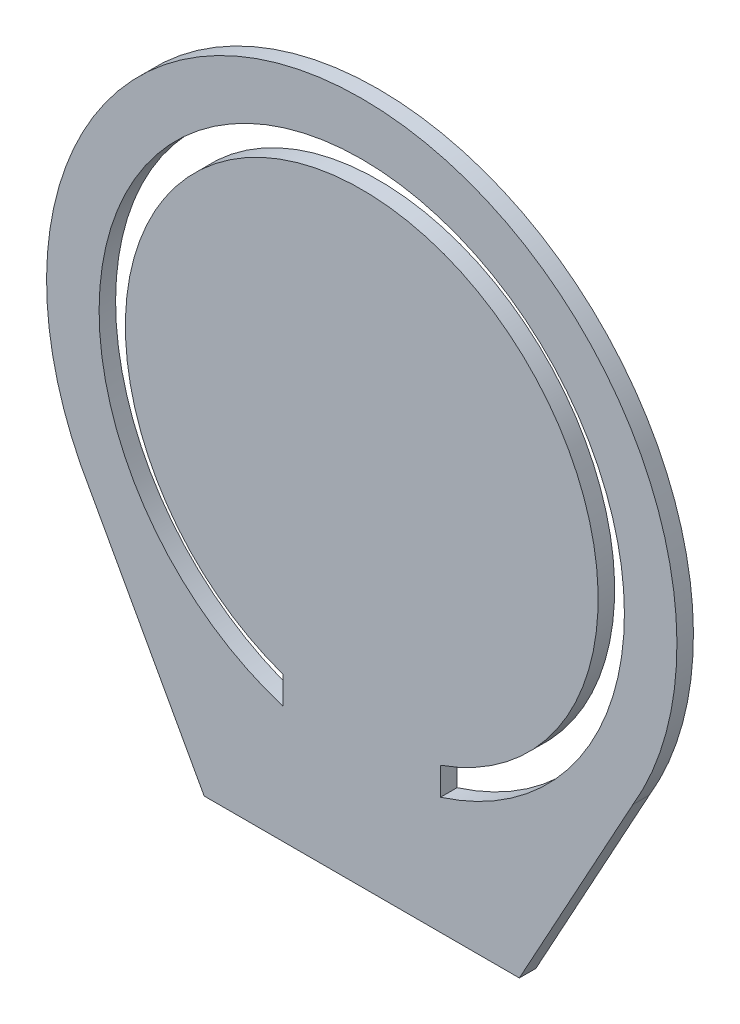
ISO-10303-21;
HEADER;
FILE_DESCRIPTION(('STEP AP214'),'2;1');
FILE_NAME('part.step','',(''),(''),'','','');
FILE_SCHEMA(('AUTOMOTIVE_DESIGN { 1 0 10303 214 1 1 1 1 }'));
ENDSEC;
DATA;
#1=APPLICATION_CONTEXT('core data for automotive mechanical design processes');
#2=APPLICATION_PROTOCOL_DEFINITION('international standard','automotive_design',2000,#1);
#3=PRODUCT_CONTEXT('',#1,'mechanical');
#4=PRODUCT('Part','Part','',(#3));
#5=PRODUCT_RELATED_PRODUCT_CATEGORY('part','',(#4));
#6=PRODUCT_DEFINITION_FORMATION('','',#4);
#7=PRODUCT_DEFINITION_CONTEXT('part definition',#1,'design');
#8=PRODUCT_DEFINITION('design','',#6,#7);
#9=PRODUCT_DEFINITION_SHAPE('','',#8);
#10=(LENGTH_UNIT() NAMED_UNIT(*) SI_UNIT(.MILLI.,.METRE.));
#11=(NAMED_UNIT(*) PLANE_ANGLE_UNIT() SI_UNIT($,.RADIAN.));
#12=(NAMED_UNIT(*) SI_UNIT($,.STERADIAN.) SOLID_ANGLE_UNIT());
#13=UNCERTAINTY_MEASURE_WITH_UNIT(LENGTH_MEASURE(1.E-05),#10,'distance_accuracy_value','');
#14=(GEOMETRIC_REPRESENTATION_CONTEXT(3) GLOBAL_UNCERTAINTY_ASSIGNED_CONTEXT((#13)) GLOBAL_UNIT_ASSIGNED_CONTEXT((#10,
#11,#12)) REPRESENTATION_CONTEXT('',''));
#15=CARTESIAN_POINT('',(0.,0.,0.));
#16=DIRECTION('',(0.,0.,1.));
#17=DIRECTION('',(1.,0.,0.));
#18=AXIS2_PLACEMENT_3D('',#15,#16,#17);
#19=CARTESIAN_POINT('',(0.,0.,1.57));
#20=DIRECTION('',(0.,0.,-1.));
#21=DIRECTION('',(-1.,0.,0.));
#22=AXIS2_PLACEMENT_3D('',#19,#20,#21);
#23=CYLINDRICAL_SURFACE('',#22,25.);
#24=DIRECTION('',(0.,0.,-1.));
#25=VECTOR('',#24,1.);
#26=CARTESIAN_POINT('',(-7.5,-23.8484800354236,1.57));
#27=LINE('',#26,#25);
#28=CARTESIAN_POINT('',(-7.5,-23.8484800354236,0.));
#29=VERTEX_POINT('',#28);
#30=CARTESIAN_POINT('',(-7.5,-23.8484800354236,1.57));
#31=VERTEX_POINT('',#30);
#32=EDGE_CURVE('E11',#29,#31,#27,.F.);
#33=ORIENTED_EDGE('',*,*,#32,.F.);
#34=CARTESIAN_POINT('',(0.,0.,0.));
#35=DIRECTION('',(0.,0.,1.));
#36=DIRECTION('',(1.,0.,0.));
#37=AXIS2_PLACEMENT_3D('',#34,#35,#36);
#38=CIRCLE('',#37,25.);
#39=CARTESIAN_POINT('',(7.5,-23.8484800354236,0.));
#40=VERTEX_POINT('',#39);
#41=EDGE_CURVE('E150',#40,#29,#38,.T.);
#42=ORIENTED_EDGE('',*,*,#41,.F.);
#43=DIRECTION('',(0.,0.,-1.));
#44=VECTOR('',#43,1.);
#45=CARTESIAN_POINT('',(7.5,-23.8484800354236,1.57));
#46=LINE('',#45,#44);
#47=CARTESIAN_POINT('',(7.5,-23.8484800354236,1.57));
#48=VERTEX_POINT('',#47);
#49=EDGE_CURVE('E48',#40,#48,#46,.F.);
#50=ORIENTED_EDGE('',*,*,#49,.T.);
#51=CARTESIAN_POINT('',(0.,0.,1.57));
#52=DIRECTION('',(0.,0.,1.));
#53=DIRECTION('',(1.,0.,0.));
#54=AXIS2_PLACEMENT_3D('',#51,#52,#53);
#55=CIRCLE('',#54,25.);
#56=EDGE_CURVE('E156',#48,#31,#55,.T.);
#57=ORIENTED_EDGE('',*,*,#56,.T.);
#58=EDGE_LOOP('',(#33,#42,#50,#57));
#59=FACE_BOUND('',#58,.T.);
#60=ADVANCED_FACE('F40',(#59),#23,.F.);
#61=CARTESIAN_POINT('',(0.,0.,1.57));
#62=DIRECTION('',(0.,0.,-1.));
#63=DIRECTION('',(-1.,0.,0.));
#64=AXIS2_PLACEMENT_3D('',#61,#62,#63);
#65=CYLINDRICAL_SURFACE('',#64,30.);
#66=DIRECTION('',(0.,0.,1.));
#67=VECTOR('',#66,1.);
#68=CARTESIAN_POINT('',(-25.8005366625302,-15.3079165115778,0.));
#69=LINE('',#68,#67);
#70=CARTESIAN_POINT('',(-25.8005366625302,-15.3079165115778,0.));
#71=VERTEX_POINT('',#70);
#72=CARTESIAN_POINT('',(-25.8005366625302,-15.3079165115778,1.57));
#73=VERTEX_POINT('',#72);
#74=EDGE_CURVE('E147',#71,#73,#69,.T.);
#75=ORIENTED_EDGE('',*,*,#74,.T.);
#76=CARTESIAN_POINT('',(0.,0.,1.57));
#77=DIRECTION('',(0.,0.,1.));
#78=DIRECTION('',(1.,0.,0.));
#79=AXIS2_PLACEMENT_3D('',#76,#77,#78);
#80=CIRCLE('',#79,30.);
#81=CARTESIAN_POINT('',(25.8005366625301,-15.3079165115779,1.57));
#82=VERTEX_POINT('',#81);
#83=EDGE_CURVE('E161',#82,#73,#80,.T.);
#84=ORIENTED_EDGE('',*,*,#83,.F.);
#85=DIRECTION('',(0.,0.,1.));
#86=VECTOR('',#85,1.);
#87=CARTESIAN_POINT('',(25.8005366625301,-15.3079165115779,0.));
#88=LINE('',#87,#86);
#89=CARTESIAN_POINT('',(25.8005366625301,-15.3079165115779,0.));
#90=VERTEX_POINT('',#89);
#91=EDGE_CURVE('E151',#90,#82,#88,.T.);
#92=ORIENTED_EDGE('',*,*,#91,.F.);
#93=CARTESIAN_POINT('',(0.,0.,0.));
#94=DIRECTION('',(0.,0.,1.));
#95=DIRECTION('',(1.,0.,0.));
#96=AXIS2_PLACEMENT_3D('',#93,#94,#95);
#97=CIRCLE('',#96,30.);
#98=EDGE_CURVE('E159',#90,#71,#97,.T.);
#99=ORIENTED_EDGE('',*,*,#98,.T.);
#100=EDGE_LOOP('',(#75,#84,#92,#99));
#101=FACE_BOUND('',#100,.T.);
#102=ADVANCED_FACE('F42',(#101),#65,.T.);
#103=CARTESIAN_POINT('',(0.,0.,1.57));
#104=DIRECTION('',(0.,0.,1.));
#105=DIRECTION('',(1.,0.,0.));
#106=AXIS2_PLACEMENT_3D('',#103,#104,#105);
#107=PLANE('',#106);
#108=DIRECTION('',(0.,1.,0.));
#109=VECTOR('',#108,1.);
#110=CARTESIAN_POINT('',(-7.5,0.,1.57));
#111=LINE('',#110,#109);
#112=CARTESIAN_POINT('',(-7.5,-21.2132034355964,1.57));
#113=VERTEX_POINT('',#112);
#114=EDGE_CURVE('E112',#31,#113,#111,.T.);
#115=ORIENTED_EDGE('',*,*,#114,.F.);
#116=ORIENTED_EDGE('',*,*,#56,.F.);
#117=DIRECTION('',(0.,1.,0.));
#118=VECTOR('',#117,1.);
#119=CARTESIAN_POINT('',(7.5,0.,1.57));
#120=LINE('',#119,#118);
#121=CARTESIAN_POINT('',(7.5,-21.2132034355964,1.57));
#122=VERTEX_POINT('',#121);
#123=EDGE_CURVE('E123',#48,#122,#120,.T.);
#124=ORIENTED_EDGE('',*,*,#123,.T.);
#125=CARTESIAN_POINT('',(0.,0.,1.57));
#126=DIRECTION('',(0.,0.,1.));
#127=DIRECTION('',(1.,0.,0.));
#128=AXIS2_PLACEMENT_3D('',#125,#126,#127);
#129=CIRCLE('',#128,22.5);
#130=EDGE_CURVE('E121',#122,#113,#129,.T.);
#131=ORIENTED_EDGE('',*,*,#130,.T.);
#132=EDGE_LOOP('',(#115,#116,#124,#131));
#133=FACE_BOUND('',#132,.T.);
#134=ORIENTED_EDGE('',*,*,#83,.T.);
#135=DIRECTION('',(-0.480889164745887,0.876781393067852,0.));
#136=VECTOR('',#135,1.);
#137=CARTESIAN_POINT('',(-26.2883976806498,-14.4184236836069,1.57));
#138=LINE('',#137,#136);
#139=CARTESIAN_POINT('',(-15.,-35.,1.57));
#140=VERTEX_POINT('',#139);
#141=EDGE_CURVE('E134',#140,#73,#138,.T.);
#142=ORIENTED_EDGE('',*,*,#141,.F.);
#143=DIRECTION('',(1.,0.,0.));
#144=VECTOR('',#143,1.);
#145=CARTESIAN_POINT('',(0.,-35.,1.57));
#146=LINE('',#145,#144);
#147=CARTESIAN_POINT('',(15.,-35.,1.57));
#148=VERTEX_POINT('',#147);
#149=EDGE_CURVE('E144',#140,#148,#146,.T.);
#150=ORIENTED_EDGE('',*,*,#149,.T.);
#151=DIRECTION('',(0.480889164745886,0.876781393067852,0.));
#152=VECTOR('',#151,1.);
#153=CARTESIAN_POINT('',(26.2883976806498,-14.4184236836069,1.57));
#154=LINE('',#153,#152);
#155=EDGE_CURVE('E63',#148,#82,#154,.T.);
#156=ORIENTED_EDGE('',*,*,#155,.T.);
#157=EDGE_LOOP('',(#134,#142,#150,#156));
#158=FACE_BOUND('',#157,.T.);
#159=ADVANCED_FACE('F169',(#133,#158),#107,.T.);
#160=CARTESIAN_POINT('',(0.,0.,0.));
#161=DIRECTION('',(0.,0.,1.));
#162=DIRECTION('',(1.,0.,0.));
#163=AXIS2_PLACEMENT_3D('',#160,#161,#162);
#164=PLANE('',#163);
#165=ORIENTED_EDGE('',*,*,#98,.F.);
#166=DIRECTION('',(0.480889164745886,0.876781393067852,0.));
#167=VECTOR('',#166,1.);
#168=CARTESIAN_POINT('',(26.2883976806498,-14.4184236836069,0.));
#169=LINE('',#168,#167);
#170=CARTESIAN_POINT('',(15.,-35.,0.));
#171=VERTEX_POINT('',#170);
#172=EDGE_CURVE('E140',#171,#90,#169,.T.);
#173=ORIENTED_EDGE('',*,*,#172,.F.);
#174=DIRECTION('',(1.,0.,0.));
#175=VECTOR('',#174,1.);
#176=CARTESIAN_POINT('',(0.,-35.,0.));
#177=LINE('',#176,#175);
#178=CARTESIAN_POINT('',(-15.,-35.,0.));
#179=VERTEX_POINT('',#178);
#180=EDGE_CURVE('E137',#179,#171,#177,.T.);
#181=ORIENTED_EDGE('',*,*,#180,.F.);
#182=DIRECTION('',(-0.480889164745887,0.876781393067852,0.));
#183=VECTOR('',#182,1.);
#184=CARTESIAN_POINT('',(-26.2883976806498,-14.4184236836069,0.));
#185=LINE('',#184,#183);
#186=EDGE_CURVE('E135',#179,#71,#185,.T.);
#187=ORIENTED_EDGE('',*,*,#186,.T.);
#188=EDGE_LOOP('',(#165,#173,#181,#187));
#189=FACE_BOUND('',#188,.T.);
#190=ORIENTED_EDGE('',*,*,#41,.T.);
#191=DIRECTION('',(0.,1.,0.));
#192=VECTOR('',#191,1.);
#193=CARTESIAN_POINT('',(-7.5,0.,0.));
#194=LINE('',#193,#192);
#195=CARTESIAN_POINT('',(-7.5,-21.2132034355964,0.));
#196=VERTEX_POINT('',#195);
#197=EDGE_CURVE('E113',#29,#196,#194,.T.);
#198=ORIENTED_EDGE('',*,*,#197,.T.);
#199=CARTESIAN_POINT('',(0.,0.,0.));
#200=DIRECTION('',(0.,0.,1.));
#201=DIRECTION('',(1.,0.,0.));
#202=AXIS2_PLACEMENT_3D('',#199,#200,#201);
#203=CIRCLE('',#202,22.5);
#204=CARTESIAN_POINT('',(7.5,-21.2132034355964,0.));
#205=VERTEX_POINT('',#204);
#206=EDGE_CURVE('E119',#205,#196,#203,.T.);
#207=ORIENTED_EDGE('',*,*,#206,.F.);
#208=DIRECTION('',(0.,1.,0.));
#209=VECTOR('',#208,1.);
#210=CARTESIAN_POINT('',(7.5,0.,0.));
#211=LINE('',#210,#209);
#212=EDGE_CURVE('E55',#40,#205,#211,.T.);
#213=ORIENTED_EDGE('',*,*,#212,.F.);
#214=EDGE_LOOP('',(#190,#198,#207,#213));
#215=FACE_BOUND('',#214,.T.);
#216=ADVANCED_FACE('F125',(#189,#215),#164,.F.);
#217=CARTESIAN_POINT('',(-26.2883976806498,-14.4184236836069,0.));
#218=DIRECTION('',(0.876781393067852,0.480889164745887,0.));
#219=DIRECTION('',(-0.480889164745887,0.876781393067852,0.));
#220=AXIS2_PLACEMENT_3D('',#217,#218,#219);
#221=PLANE('',#220);
#222=ORIENTED_EDGE('',*,*,#141,.T.);
#223=ORIENTED_EDGE('',*,*,#74,.F.);
#224=ORIENTED_EDGE('',*,*,#186,.F.);
#225=DIRECTION('',(0.,0.,1.));
#226=VECTOR('',#225,1.);
#227=CARTESIAN_POINT('',(-15.,-35.,0.));
#228=LINE('',#227,#226);
#229=EDGE_CURVE('E142',#179,#140,#228,.T.);
#230=ORIENTED_EDGE('',*,*,#229,.T.);
#231=EDGE_LOOP('',(#222,#223,#224,#230));
#232=FACE_BOUND('',#231,.T.);
#233=ADVANCED_FACE('F192',(#232),#221,.F.);
#234=CARTESIAN_POINT('',(26.2883976806498,-14.4184236836069,0.));
#235=DIRECTION('',(0.876781393067852,-0.480889164745886,0.));
#236=DIRECTION('',(0.480889164745886,0.876781393067852,0.));
#237=AXIS2_PLACEMENT_3D('',#234,#235,#236);
#238=PLANE('',#237);
#239=ORIENTED_EDGE('',*,*,#155,.F.);
#240=DIRECTION('',(0.,0.,1.));
#241=VECTOR('',#240,1.);
#242=CARTESIAN_POINT('',(15.,-35.,0.));
#243=LINE('',#242,#241);
#244=EDGE_CURVE('E153',#171,#148,#243,.T.);
#245=ORIENTED_EDGE('',*,*,#244,.F.);
#246=ORIENTED_EDGE('',*,*,#172,.T.);
#247=ORIENTED_EDGE('',*,*,#91,.T.);
#248=EDGE_LOOP('',(#239,#245,#246,#247));
#249=FACE_BOUND('',#248,.T.);
#250=ADVANCED_FACE('F180',(#249),#238,.T.);
#251=CARTESIAN_POINT('',(0.,-35.,0.));
#252=DIRECTION('',(0.,-1.,0.));
#253=DIRECTION('',(0.,0.,-1.));
#254=AXIS2_PLACEMENT_3D('',#251,#252,#253);
#255=PLANE('',#254);
#256=ORIENTED_EDGE('',*,*,#149,.F.);
#257=ORIENTED_EDGE('',*,*,#229,.F.);
#258=ORIENTED_EDGE('',*,*,#180,.T.);
#259=ORIENTED_EDGE('',*,*,#244,.T.);
#260=EDGE_LOOP('',(#256,#257,#258,#259));
#261=FACE_BOUND('',#260,.T.);
#262=ADVANCED_FACE('F173',(#261),#255,.T.);
#263=CARTESIAN_POINT('',(-7.5,0.,1.57));
#264=DIRECTION('',(-1.,0.,0.));
#265=DIRECTION('',(0.,0.,1.));
#266=AXIS2_PLACEMENT_3D('',#263,#264,#265);
#267=PLANE('',#266);
#268=ORIENTED_EDGE('',*,*,#197,.F.);
#269=ORIENTED_EDGE('',*,*,#32,.T.);
#270=ORIENTED_EDGE('',*,*,#114,.T.);
#271=DIRECTION('',(0.,0.,-1.));
#272=VECTOR('',#271,1.);
#273=CARTESIAN_POINT('',(-7.5,-21.2132034355964,1.57));
#274=LINE('',#273,#272);
#275=EDGE_CURVE('E122',#113,#196,#274,.T.);
#276=ORIENTED_EDGE('',*,*,#275,.T.);
#277=EDGE_LOOP('',(#268,#269,#270,#276));
#278=FACE_BOUND('',#277,.T.);
#279=ADVANCED_FACE('F171',(#278),#267,.T.);
#280=CARTESIAN_POINT('',(7.5,0.,1.57));
#281=DIRECTION('',(-1.,0.,0.));
#282=DIRECTION('',(0.,0.,1.));
#283=AXIS2_PLACEMENT_3D('',#280,#281,#282);
#284=PLANE('',#283);
#285=ORIENTED_EDGE('',*,*,#49,.F.);
#286=ORIENTED_EDGE('',*,*,#212,.T.);
#287=DIRECTION('',(0.,0.,-1.));
#288=VECTOR('',#287,1.);
#289=CARTESIAN_POINT('',(7.5,-21.2132034355964,1.57));
#290=LINE('',#289,#288);
#291=EDGE_CURVE('E108',#122,#205,#290,.T.);
#292=ORIENTED_EDGE('',*,*,#291,.F.);
#293=ORIENTED_EDGE('',*,*,#123,.F.);
#294=EDGE_LOOP('',(#285,#286,#292,#293));
#295=FACE_BOUND('',#294,.T.);
#296=ADVANCED_FACE('F107',(#295),#284,.F.);
#297=CARTESIAN_POINT('',(0.,0.,0.));
#298=DIRECTION('',(0.,0.,1.));
#299=DIRECTION('',(1.,0.,0.));
#300=AXIS2_PLACEMENT_3D('',#297,#298,#299);
#301=CYLINDRICAL_SURFACE('',#300,22.5);
#302=ORIENTED_EDGE('',*,*,#206,.T.);
#303=ORIENTED_EDGE('',*,*,#275,.F.);
#304=ORIENTED_EDGE('',*,*,#130,.F.);
#305=ORIENTED_EDGE('',*,*,#291,.T.);
#306=EDGE_LOOP('',(#302,#303,#304,#305));
#307=FACE_BOUND('',#306,.T.);
#308=ADVANCED_FACE('F117',(#307),#301,.T.);
#309=CLOSED_SHELL('',(#60,#102,#159,#216,#233,#250,#262,#279,#296,#308));
#310=MANIFOLD_SOLID_BREP('B2',#309);
#311=ADVANCED_BREP_SHAPE_REPRESENTATION('',(#18,#310),#14);
#312=SHAPE_DEFINITION_REPRESENTATION(#9,#311);
ENDSEC;
END-ISO-10303-21;
